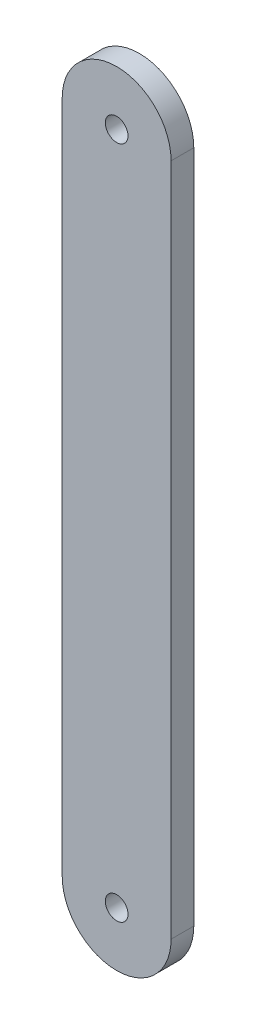
ISO-10303-21;
HEADER;
FILE_DESCRIPTION(('STEP AP214'),'2;1');
FILE_NAME('part.step','',(''),(''),'','','');
FILE_SCHEMA(('AUTOMOTIVE_DESIGN { 1 0 10303 214 1 1 1 1 }'));
ENDSEC;
DATA;
#1=APPLICATION_CONTEXT('core data for automotive mechanical design processes');
#2=APPLICATION_PROTOCOL_DEFINITION('international standard','automotive_design',2000,#1);
#3=PRODUCT_CONTEXT('',#1,'mechanical');
#4=PRODUCT('Part','Part','',(#3));
#5=PRODUCT_RELATED_PRODUCT_CATEGORY('part','',(#4));
#6=PRODUCT_DEFINITION_FORMATION('','',#4);
#7=PRODUCT_DEFINITION_CONTEXT('part definition',#1,'design');
#8=PRODUCT_DEFINITION('design','',#6,#7);
#9=PRODUCT_DEFINITION_SHAPE('','',#8);
#10=(LENGTH_UNIT() NAMED_UNIT(*) SI_UNIT(.MILLI.,.METRE.));
#11=(NAMED_UNIT(*) PLANE_ANGLE_UNIT() SI_UNIT($,.RADIAN.));
#12=(NAMED_UNIT(*) SI_UNIT($,.STERADIAN.) SOLID_ANGLE_UNIT());
#13=UNCERTAINTY_MEASURE_WITH_UNIT(LENGTH_MEASURE(1.E-05),#10,'distance_accuracy_value','');
#14=(GEOMETRIC_REPRESENTATION_CONTEXT(3) GLOBAL_UNCERTAINTY_ASSIGNED_CONTEXT((#13)) GLOBAL_UNIT_ASSIGNED_CONTEXT((#10,
#11,#12)) REPRESENTATION_CONTEXT('',''));
#15=CARTESIAN_POINT('',(0.,0.,0.));
#16=DIRECTION('',(0.,0.,1.));
#17=DIRECTION('',(1.,0.,0.));
#18=AXIS2_PLACEMENT_3D('',#15,#16,#17);
#19=CARTESIAN_POINT('',(0.,-74.2799999999999,0.));
#20=DIRECTION('',(0.,0.,1.));
#21=DIRECTION('',(1.,0.,0.));
#22=AXIS2_PLACEMENT_3D('',#19,#20,#21);
#23=CYLINDRICAL_SURFACE('',#22,12.);
#24=CARTESIAN_POINT('',(0.,-74.2799999999999,5.));
#25=DIRECTION('',(0.,0.,1.));
#26=DIRECTION('',(1.,0.,0.));
#27=AXIS2_PLACEMENT_3D('',#24,#25,#26);
#28=CIRCLE('',#27,12.);
#29=CARTESIAN_POINT('',(-12.,-74.2799999999999,5.));
#30=VERTEX_POINT('',#29);
#31=CARTESIAN_POINT('',(12.,-74.2799999999999,5.));
#32=VERTEX_POINT('',#31);
#33=EDGE_CURVE('E110',#30,#32,#28,.T.);
#34=ORIENTED_EDGE('',*,*,#33,.F.);
#35=DIRECTION('',(0.,0.,1.));
#36=VECTOR('',#35,1.);
#37=CARTESIAN_POINT('',(-12.,-74.2799999999999,0.));
#38=LINE('',#37,#36);
#39=CARTESIAN_POINT('',(-12.,-74.2799999999999,0.));
#40=VERTEX_POINT('',#39);
#41=EDGE_CURVE('E11',#40,#30,#38,.T.);
#42=ORIENTED_EDGE('',*,*,#41,.F.);
#43=CARTESIAN_POINT('',(0.,-74.2799999999999,0.));
#44=DIRECTION('',(0.,0.,1.));
#45=DIRECTION('',(1.,0.,0.));
#46=AXIS2_PLACEMENT_3D('',#43,#44,#45);
#47=CIRCLE('',#46,12.);
#48=CARTESIAN_POINT('',(12.,-74.2799999999999,0.));
#49=VERTEX_POINT('',#48);
#50=EDGE_CURVE('E101',#40,#49,#47,.T.);
#51=ORIENTED_EDGE('',*,*,#50,.T.);
#52=DIRECTION('',(0.,0.,1.));
#53=VECTOR('',#52,1.);
#54=CARTESIAN_POINT('',(12.,-74.2799999999999,0.));
#55=LINE('',#54,#53);
#56=EDGE_CURVE('E42',#49,#32,#55,.T.);
#57=ORIENTED_EDGE('',*,*,#56,.T.);
#58=EDGE_LOOP('',(#34,#42,#51,#57));
#59=FACE_BOUND('',#58,.T.);
#60=ADVANCED_FACE('F39',(#59),#23,.T.);
#61=CARTESIAN_POINT('',(-12.,74.2799999999999,0.));
#62=DIRECTION('',(-1.,0.,0.));
#63=DIRECTION('',(0.,0.,1.));
#64=AXIS2_PLACEMENT_3D('',#61,#62,#63);
#65=PLANE('',#64);
#66=DIRECTION('',(0.,-1.,0.));
#67=VECTOR('',#66,1.);
#68=CARTESIAN_POINT('',(-12.,74.2799999999999,5.));
#69=LINE('',#68,#67);
#70=CARTESIAN_POINT('',(-12.,74.2799999999999,5.));
#71=VERTEX_POINT('',#70);
#72=EDGE_CURVE('E104',#71,#30,#69,.T.);
#73=ORIENTED_EDGE('',*,*,#72,.F.);
#74=DIRECTION('',(0.,0.,1.));
#75=VECTOR('',#74,1.);
#76=CARTESIAN_POINT('',(-12.,74.2799999999999,0.));
#77=LINE('',#76,#75);
#78=CARTESIAN_POINT('',(-12.,74.2799999999999,0.));
#79=VERTEX_POINT('',#78);
#80=EDGE_CURVE('E49',#79,#71,#77,.T.);
#81=ORIENTED_EDGE('',*,*,#80,.F.);
#82=DIRECTION('',(0.,-1.,0.));
#83=VECTOR('',#82,1.);
#84=CARTESIAN_POINT('',(-12.,74.2799999999999,0.));
#85=LINE('',#84,#83);
#86=EDGE_CURVE('E96',#79,#40,#85,.T.);
#87=ORIENTED_EDGE('',*,*,#86,.T.);
#88=ORIENTED_EDGE('',*,*,#41,.T.);
#89=EDGE_LOOP('',(#73,#81,#87,#88));
#90=FACE_BOUND('',#89,.T.);
#91=ADVANCED_FACE('F127',(#90),#65,.T.);
#92=CARTESIAN_POINT('',(0.,74.2799999999999,0.));
#93=DIRECTION('',(0.,0.,1.));
#94=DIRECTION('',(1.,0.,0.));
#95=AXIS2_PLACEMENT_3D('',#92,#93,#94);
#96=CYLINDRICAL_SURFACE('',#95,12.);
#97=CARTESIAN_POINT('',(0.,74.2799999999999,5.));
#98=DIRECTION('',(0.,0.,1.));
#99=DIRECTION('',(1.,0.,0.));
#100=AXIS2_PLACEMENT_3D('',#97,#98,#99);
#101=CIRCLE('',#100,12.);
#102=CARTESIAN_POINT('',(12.,74.2799999999999,5.));
#103=VERTEX_POINT('',#102);
#104=EDGE_CURVE('E90',#103,#71,#101,.T.);
#105=ORIENTED_EDGE('',*,*,#104,.F.);
#106=DIRECTION('',(0.,0.,1.));
#107=VECTOR('',#106,1.);
#108=CARTESIAN_POINT('',(12.,74.2799999999999,0.));
#109=LINE('',#108,#107);
#110=CARTESIAN_POINT('',(12.,74.2799999999999,0.));
#111=VERTEX_POINT('',#110);
#112=EDGE_CURVE('E85',#111,#103,#109,.T.);
#113=ORIENTED_EDGE('',*,*,#112,.F.);
#114=CARTESIAN_POINT('',(0.,74.2799999999999,0.));
#115=DIRECTION('',(0.,0.,1.));
#116=DIRECTION('',(1.,0.,0.));
#117=AXIS2_PLACEMENT_3D('',#114,#115,#116);
#118=CIRCLE('',#117,12.);
#119=EDGE_CURVE('E88',#111,#79,#118,.T.);
#120=ORIENTED_EDGE('',*,*,#119,.T.);
#121=ORIENTED_EDGE('',*,*,#80,.T.);
#122=EDGE_LOOP('',(#105,#113,#120,#121));
#123=FACE_BOUND('',#122,.T.);
#124=ADVANCED_FACE('F87',(#123),#96,.T.);
#125=CARTESIAN_POINT('',(12.,-74.2799999999999,0.));
#126=DIRECTION('',(1.,0.,0.));
#127=DIRECTION('',(0.,1.,0.));
#128=AXIS2_PLACEMENT_3D('',#125,#126,#127);
#129=PLANE('',#128);
#130=DIRECTION('',(0.,1.,0.));
#131=VECTOR('',#130,1.);
#132=CARTESIAN_POINT('',(12.,-74.2799999999999,5.));
#133=LINE('',#132,#131);
#134=EDGE_CURVE('E114',#32,#103,#133,.T.);
#135=ORIENTED_EDGE('',*,*,#134,.F.);
#136=ORIENTED_EDGE('',*,*,#56,.F.);
#137=DIRECTION('',(0.,1.,0.));
#138=VECTOR('',#137,1.);
#139=CARTESIAN_POINT('',(12.,-74.2799999999999,0.));
#140=LINE('',#139,#138);
#141=EDGE_CURVE('E95',#49,#111,#140,.T.);
#142=ORIENTED_EDGE('',*,*,#141,.T.);
#143=ORIENTED_EDGE('',*,*,#112,.T.);
#144=EDGE_LOOP('',(#135,#136,#142,#143));
#145=FACE_BOUND('',#144,.T.);
#146=ADVANCED_FACE('F99',(#145),#129,.T.);
#147=CARTESIAN_POINT('',(0.,-74.2799999999999,0.));
#148=DIRECTION('',(0.,0.,1.));
#149=DIRECTION('',(1.,0.,0.));
#150=AXIS2_PLACEMENT_3D('',#147,#148,#149);
#151=PLANE('',#150);
#152=CARTESIAN_POINT('',(0.,74.2799999999999,0.));
#153=DIRECTION('',(0.,0.,1.));
#154=DIRECTION('',(-1.,0.,0.));
#155=AXIS2_PLACEMENT_3D('',#152,#153,#154);
#156=CIRCLE('',#155,2.5);
#157=CARTESIAN_POINT('',(-2.5,74.2799999999999,0.));
#158=VERTEX_POINT('',#157);
#159=EDGE_CURVE('E160',#158,#158,#156,.T.);
#160=ORIENTED_EDGE('',*,*,#159,.T.);
#161=EDGE_LOOP('',(#160));
#162=FACE_BOUND('',#161,.T.);
#163=CARTESIAN_POINT('',(0.,-74.2799999999999,0.));
#164=DIRECTION('',(0.,0.,1.));
#165=DIRECTION('',(-1.,0.,0.));
#166=AXIS2_PLACEMENT_3D('',#163,#164,#165);
#167=CIRCLE('',#166,2.5);
#168=CARTESIAN_POINT('',(-2.5,-74.2799999999999,0.));
#169=VERTEX_POINT('',#168);
#170=EDGE_CURVE('E115',#169,#169,#167,.T.);
#171=ORIENTED_EDGE('',*,*,#170,.T.);
#172=EDGE_LOOP('',(#171));
#173=FACE_BOUND('',#172,.T.);
#174=ORIENTED_EDGE('',*,*,#50,.F.);
#175=ORIENTED_EDGE('',*,*,#86,.F.);
#176=ORIENTED_EDGE('',*,*,#119,.F.);
#177=ORIENTED_EDGE('',*,*,#141,.F.);
#178=EDGE_LOOP('',(#174,#175,#176,#177));
#179=FACE_BOUND('',#178,.T.);
#180=ADVANCED_FACE('F94',(#162,#173,#179),#151,.F.);
#181=CARTESIAN_POINT('',(0.,-74.2799999999999,5.));
#182=DIRECTION('',(0.,0.,1.));
#183=DIRECTION('',(1.,0.,0.));
#184=AXIS2_PLACEMENT_3D('',#181,#182,#183);
#185=PLANE('',#184);
#186=CARTESIAN_POINT('',(0.,74.2799999999999,5.));
#187=DIRECTION('',(0.,0.,1.));
#188=DIRECTION('',(-1.,0.,0.));
#189=AXIS2_PLACEMENT_3D('',#186,#187,#188);
#190=CIRCLE('',#189,2.5);
#191=CARTESIAN_POINT('',(-2.5,74.2799999999999,5.));
#192=VERTEX_POINT('',#191);
#193=EDGE_CURVE('E163',#192,#192,#190,.T.);
#194=ORIENTED_EDGE('',*,*,#193,.F.);
#195=EDGE_LOOP('',(#194));
#196=FACE_BOUND('',#195,.T.);
#197=CARTESIAN_POINT('',(0.,-74.2799999999999,5.));
#198=DIRECTION('',(0.,0.,1.));
#199=DIRECTION('',(-1.,0.,0.));
#200=AXIS2_PLACEMENT_3D('',#197,#198,#199);
#201=CIRCLE('',#200,2.5);
#202=CARTESIAN_POINT('',(-2.5,-74.2799999999999,5.));
#203=VERTEX_POINT('',#202);
#204=EDGE_CURVE('E167',#203,#203,#201,.T.);
#205=ORIENTED_EDGE('',*,*,#204,.F.);
#206=EDGE_LOOP('',(#205));
#207=FACE_BOUND('',#206,.T.);
#208=ORIENTED_EDGE('',*,*,#33,.T.);
#209=ORIENTED_EDGE('',*,*,#134,.T.);
#210=ORIENTED_EDGE('',*,*,#104,.T.);
#211=ORIENTED_EDGE('',*,*,#72,.T.);
#212=EDGE_LOOP('',(#208,#209,#210,#211));
#213=FACE_BOUND('',#212,.T.);
#214=ADVANCED_FACE('F126',(#196,#207,#213),#185,.T.);
#215=CARTESIAN_POINT('',(0.,-74.2799999999999,0.));
#216=DIRECTION('',(0.,0.,1.));
#217=DIRECTION('',(1.,0.,0.));
#218=AXIS2_PLACEMENT_3D('',#215,#216,#217);
#219=CYLINDRICAL_SURFACE('',#218,2.5);
#220=ORIENTED_EDGE('',*,*,#170,.F.);
#221=EDGE_LOOP('',(#220));
#222=FACE_BOUND('',#221,.T.);
#223=ORIENTED_EDGE('',*,*,#204,.T.);
#224=EDGE_LOOP('',(#223));
#225=FACE_BOUND('',#224,.T.);
#226=ADVANCED_FACE('F145',(#222,#225),#219,.F.);
#227=CARTESIAN_POINT('',(0.,74.2799999999999,0.));
#228=DIRECTION('',(0.,0.,1.));
#229=DIRECTION('',(1.,0.,0.));
#230=AXIS2_PLACEMENT_3D('',#227,#228,#229);
#231=CYLINDRICAL_SURFACE('',#230,2.5);
#232=ORIENTED_EDGE('',*,*,#159,.F.);
#233=EDGE_LOOP('',(#232));
#234=FACE_BOUND('',#233,.T.);
#235=ORIENTED_EDGE('',*,*,#193,.T.);
#236=EDGE_LOOP('',(#235));
#237=FACE_BOUND('',#236,.T.);
#238=ADVANCED_FACE('F152',(#234,#237),#231,.F.);
#239=CLOSED_SHELL('',(#60,#91,#124,#146,#180,#214,#226,#238));
#240=MANIFOLD_SOLID_BREP('B2',#239);
#241=ADVANCED_BREP_SHAPE_REPRESENTATION('',(#18,#240),#14);
#242=SHAPE_DEFINITION_REPRESENTATION(#9,#241);
ENDSEC;
END-ISO-10303-21;
